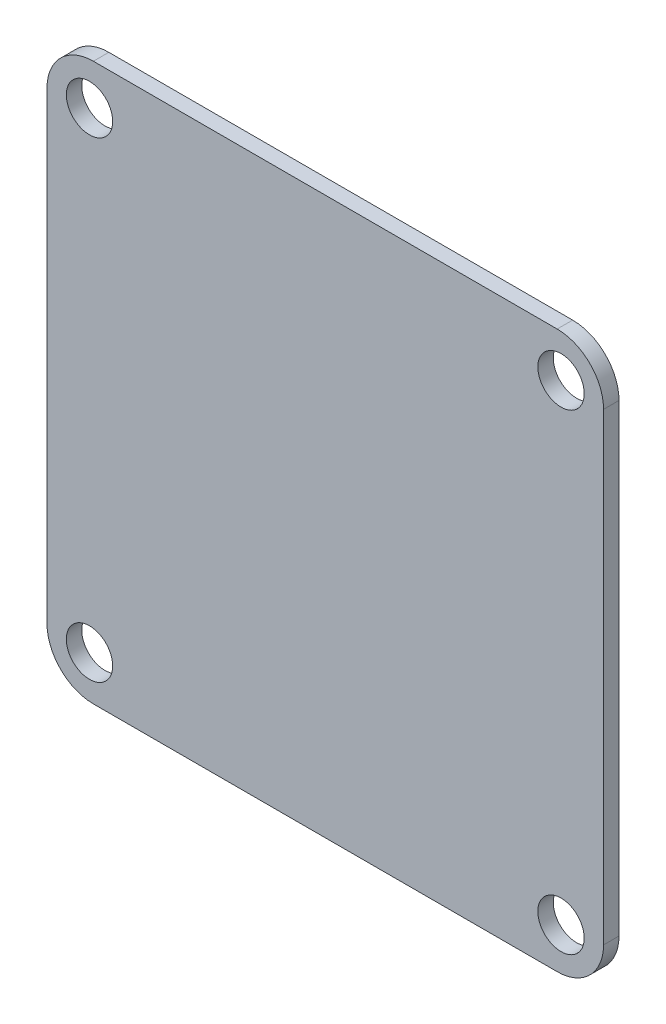
ISO-10303-21;
HEADER;
FILE_DESCRIPTION(('STEP AP214'),'2;1');
FILE_NAME('part.step','',(''),(''),'','','');
FILE_SCHEMA(('AUTOMOTIVE_DESIGN { 1 0 10303 214 1 1 1 1 }'));
ENDSEC;
DATA;
#1=APPLICATION_CONTEXT('core data for automotive mechanical design processes');
#2=APPLICATION_PROTOCOL_DEFINITION('international standard','automotive_design',2000,#1);
#3=PRODUCT_CONTEXT('',#1,'mechanical');
#4=PRODUCT('Part','Part','',(#3));
#5=PRODUCT_RELATED_PRODUCT_CATEGORY('part','',(#4));
#6=PRODUCT_DEFINITION_FORMATION('','',#4);
#7=PRODUCT_DEFINITION_CONTEXT('part definition',#1,'design');
#8=PRODUCT_DEFINITION('design','',#6,#7);
#9=PRODUCT_DEFINITION_SHAPE('','',#8);
#10=(LENGTH_UNIT() NAMED_UNIT(*) SI_UNIT(.MILLI.,.METRE.));
#11=(NAMED_UNIT(*) PLANE_ANGLE_UNIT() SI_UNIT($,.RADIAN.));
#12=(NAMED_UNIT(*) SI_UNIT($,.STERADIAN.) SOLID_ANGLE_UNIT());
#13=UNCERTAINTY_MEASURE_WITH_UNIT(LENGTH_MEASURE(1.E-05),#10,'distance_accuracy_value','');
#14=(GEOMETRIC_REPRESENTATION_CONTEXT(3) GLOBAL_UNCERTAINTY_ASSIGNED_CONTEXT((#13)) GLOBAL_UNIT_ASSIGNED_CONTEXT((#10,
#11,#12)) REPRESENTATION_CONTEXT('',''));
#15=CARTESIAN_POINT('',(0.,0.,0.));
#16=DIRECTION('',(0.,0.,1.));
#17=DIRECTION('',(1.,0.,0.));
#18=AXIS2_PLACEMENT_3D('',#15,#16,#17);
#19=CARTESIAN_POINT('',(-18.,-18.,1.));
#20=DIRECTION('',(1.,0.,0.));
#21=DIRECTION('',(0.,0.,-1.));
#22=AXIS2_PLACEMENT_3D('',#19,#20,#21);
#23=PLANE('',#22);
#24=DIRECTION('',(0.,-1.,0.));
#25=VECTOR('',#24,1.);
#26=CARTESIAN_POINT('',(-18.,-18.,0.));
#27=LINE('',#26,#25);
#28=CARTESIAN_POINT('',(-18.,15.,0.));
#29=VERTEX_POINT('',#28);
#30=CARTESIAN_POINT('',(-18.,-15.,0.));
#31=VERTEX_POINT('',#30);
#32=EDGE_CURVE('E130',#29,#31,#27,.T.);
#33=ORIENTED_EDGE('',*,*,#32,.T.);
#34=DIRECTION('',(0.,0.,-1.));
#35=VECTOR('',#34,1.);
#36=CARTESIAN_POINT('',(-18.,-15.,1.));
#37=LINE('',#36,#35);
#38=CARTESIAN_POINT('',(-18.,-15.,1.));
#39=VERTEX_POINT('',#38);
#40=EDGE_CURVE('E108',#31,#39,#37,.F.);
#41=ORIENTED_EDGE('',*,*,#40,.T.);
#42=DIRECTION('',(0.,-1.,0.));
#43=VECTOR('',#42,1.);
#44=CARTESIAN_POINT('',(-18.,-18.,1.));
#45=LINE('',#44,#43);
#46=CARTESIAN_POINT('',(-18.,15.,1.));
#47=VERTEX_POINT('',#46);
#48=EDGE_CURVE('E140',#47,#39,#45,.T.);
#49=ORIENTED_EDGE('',*,*,#48,.F.);
#50=DIRECTION('',(0.,0.,-1.));
#51=VECTOR('',#50,1.);
#52=CARTESIAN_POINT('',(-18.,15.,1.));
#53=LINE('',#52,#51);
#54=EDGE_CURVE('E113',#47,#29,#53,.T.);
#55=ORIENTED_EDGE('',*,*,#54,.T.);
#56=EDGE_LOOP('',(#33,#41,#49,#55));
#57=FACE_BOUND('',#56,.T.);
#58=ADVANCED_FACE('F37',(#57),#23,.F.);
#59=CARTESIAN_POINT('',(18.,-18.,1.));
#60=DIRECTION('',(0.,1.,0.));
#61=DIRECTION('',(-1.,0.,0.));
#62=AXIS2_PLACEMENT_3D('',#59,#60,#61);
#63=PLANE('',#62);
#64=DIRECTION('',(1.,0.,0.));
#65=VECTOR('',#64,1.);
#66=CARTESIAN_POINT('',(18.,-18.,1.));
#67=LINE('',#66,#65);
#68=CARTESIAN_POINT('',(-15.,-18.,1.));
#69=VERTEX_POINT('',#68);
#70=CARTESIAN_POINT('',(15.,-18.,1.));
#71=VERTEX_POINT('',#70);
#72=EDGE_CURVE('E123',#69,#71,#67,.T.);
#73=ORIENTED_EDGE('',*,*,#72,.F.);
#74=DIRECTION('',(0.,0.,-1.));
#75=VECTOR('',#74,1.);
#76=CARTESIAN_POINT('',(-15.,-18.,1.));
#77=LINE('',#76,#75);
#78=CARTESIAN_POINT('',(-15.,-18.,0.));
#79=VERTEX_POINT('',#78);
#80=EDGE_CURVE('E107',#69,#79,#77,.T.);
#81=ORIENTED_EDGE('',*,*,#80,.T.);
#82=DIRECTION('',(1.,0.,0.));
#83=VECTOR('',#82,1.);
#84=CARTESIAN_POINT('',(18.,-18.,0.));
#85=LINE('',#84,#83);
#86=CARTESIAN_POINT('',(15.,-18.,0.));
#87=VERTEX_POINT('',#86);
#88=EDGE_CURVE('E120',#79,#87,#85,.T.);
#89=ORIENTED_EDGE('',*,*,#88,.T.);
#90=DIRECTION('',(0.,0.,-1.));
#91=VECTOR('',#90,1.);
#92=CARTESIAN_POINT('',(15.,-18.,1.));
#93=LINE('',#92,#91);
#94=EDGE_CURVE('E125',#87,#71,#93,.F.);
#95=ORIENTED_EDGE('',*,*,#94,.T.);
#96=EDGE_LOOP('',(#73,#81,#89,#95));
#97=FACE_BOUND('',#96,.T.);
#98=ADVANCED_FACE('F119',(#97),#63,.F.);
#99=CARTESIAN_POINT('',(18.,-18.,1.));
#100=DIRECTION('',(-1.,0.,0.));
#101=DIRECTION('',(0.,0.,1.));
#102=AXIS2_PLACEMENT_3D('',#99,#100,#101);
#103=PLANE('',#102);
#104=DIRECTION('',(0.,1.,0.));
#105=VECTOR('',#104,1.);
#106=CARTESIAN_POINT('',(18.,-18.,1.));
#107=LINE('',#106,#105);
#108=CARTESIAN_POINT('',(18.,-15.,1.));
#109=VERTEX_POINT('',#108);
#110=CARTESIAN_POINT('',(18.,15.,1.));
#111=VERTEX_POINT('',#110);
#112=EDGE_CURVE('E166',#109,#111,#107,.T.);
#113=ORIENTED_EDGE('',*,*,#112,.F.);
#114=DIRECTION('',(0.,0.,-1.));
#115=VECTOR('',#114,1.);
#116=CARTESIAN_POINT('',(18.,-15.,1.));
#117=LINE('',#116,#115);
#118=CARTESIAN_POINT('',(18.,-15.,0.));
#119=VERTEX_POINT('',#118);
#120=EDGE_CURVE('E159',#109,#119,#117,.T.);
#121=ORIENTED_EDGE('',*,*,#120,.T.);
#122=DIRECTION('',(0.,1.,0.));
#123=VECTOR('',#122,1.);
#124=CARTESIAN_POINT('',(18.,-18.,0.));
#125=LINE('',#124,#123);
#126=CARTESIAN_POINT('',(18.,15.,0.));
#127=VERTEX_POINT('',#126);
#128=EDGE_CURVE('E129',#119,#127,#125,.T.);
#129=ORIENTED_EDGE('',*,*,#128,.T.);
#130=DIRECTION('',(0.,0.,-1.));
#131=VECTOR('',#130,1.);
#132=CARTESIAN_POINT('',(18.,15.,1.));
#133=LINE('',#132,#131);
#134=EDGE_CURVE('E157',#127,#111,#133,.F.);
#135=ORIENTED_EDGE('',*,*,#134,.T.);
#136=EDGE_LOOP('',(#113,#121,#129,#135));
#137=FACE_BOUND('',#136,.T.);
#138=ADVANCED_FACE('F164',(#137),#103,.F.);
#139=CARTESIAN_POINT('',(18.,18.,1.));
#140=DIRECTION('',(0.,-1.,0.));
#141=DIRECTION('',(1.,0.,0.));
#142=AXIS2_PLACEMENT_3D('',#139,#140,#141);
#143=PLANE('',#142);
#144=DIRECTION('',(-1.,0.,0.));
#145=VECTOR('',#144,1.);
#146=CARTESIAN_POINT('',(18.,18.,1.));
#147=LINE('',#146,#145);
#148=CARTESIAN_POINT('',(15.,18.,1.));
#149=VERTEX_POINT('',#148);
#150=CARTESIAN_POINT('',(-15.,18.,1.));
#151=VERTEX_POINT('',#150);
#152=EDGE_CURVE('E141',#149,#151,#147,.T.);
#153=ORIENTED_EDGE('',*,*,#152,.F.);
#154=DIRECTION('',(0.,0.,-1.));
#155=VECTOR('',#154,1.);
#156=CARTESIAN_POINT('',(15.,18.,1.));
#157=LINE('',#156,#155);
#158=CARTESIAN_POINT('',(15.,18.,0.));
#159=VERTEX_POINT('',#158);
#160=EDGE_CURVE('E11',#149,#159,#157,.T.);
#161=ORIENTED_EDGE('',*,*,#160,.T.);
#162=DIRECTION('',(-1.,0.,0.));
#163=VECTOR('',#162,1.);
#164=CARTESIAN_POINT('',(18.,18.,0.));
#165=LINE('',#164,#163);
#166=CARTESIAN_POINT('',(-15.,18.,0.));
#167=VERTEX_POINT('',#166);
#168=EDGE_CURVE('E133',#159,#167,#165,.T.);
#169=ORIENTED_EDGE('',*,*,#168,.T.);
#170=DIRECTION('',(0.,0.,-1.));
#171=VECTOR('',#170,1.);
#172=CARTESIAN_POINT('',(-15.,18.,1.));
#173=LINE('',#172,#171);
#174=EDGE_CURVE('E45',#167,#151,#173,.F.);
#175=ORIENTED_EDGE('',*,*,#174,.T.);
#176=EDGE_LOOP('',(#153,#161,#169,#175));
#177=FACE_BOUND('',#176,.T.);
#178=ADVANCED_FACE('F173',(#177),#143,.F.);
#179=CARTESIAN_POINT('',(0.,0.,1.));
#180=DIRECTION('',(0.,0.,1.));
#181=DIRECTION('',(1.,0.,0.));
#182=AXIS2_PLACEMENT_3D('',#179,#180,#181);
#183=PLANE('',#182);
#184=CARTESIAN_POINT('',(-15.25,-15.25,1.));
#185=DIRECTION('',(0.,0.,1.));
#186=DIRECTION('',(1.,0.,0.));
#187=AXIS2_PLACEMENT_3D('',#184,#185,#186);
#188=CIRCLE('',#187,1.5);
#189=CARTESIAN_POINT('',(-13.75,-15.25,1.));
#190=VERTEX_POINT('',#189);
#191=EDGE_CURVE('E189',#190,#190,#188,.T.);
#192=ORIENTED_EDGE('',*,*,#191,.F.);
#193=EDGE_LOOP('',(#192));
#194=FACE_BOUND('',#193,.T.);
#195=CARTESIAN_POINT('',(15.25,-15.25,1.));
#196=DIRECTION('',(0.,0.,1.));
#197=DIRECTION('',(1.,0.,0.));
#198=AXIS2_PLACEMENT_3D('',#195,#196,#197);
#199=CIRCLE('',#198,1.5);
#200=CARTESIAN_POINT('',(16.75,-15.25,1.));
#201=VERTEX_POINT('',#200);
#202=EDGE_CURVE('E195',#201,#201,#199,.T.);
#203=ORIENTED_EDGE('',*,*,#202,.F.);
#204=EDGE_LOOP('',(#203));
#205=FACE_BOUND('',#204,.T.);
#206=CARTESIAN_POINT('',(15.25,15.25,1.));
#207=DIRECTION('',(0.,0.,1.));
#208=DIRECTION('',(1.,0.,0.));
#209=AXIS2_PLACEMENT_3D('',#206,#207,#208);
#210=CIRCLE('',#209,1.5);
#211=CARTESIAN_POINT('',(16.75,15.25,1.));
#212=VERTEX_POINT('',#211);
#213=EDGE_CURVE('E183',#212,#212,#210,.T.);
#214=ORIENTED_EDGE('',*,*,#213,.F.);
#215=EDGE_LOOP('',(#214));
#216=FACE_BOUND('',#215,.T.);
#217=CARTESIAN_POINT('',(-15.25,15.25,1.));
#218=DIRECTION('',(0.,0.,1.));
#219=DIRECTION('',(1.,0.,0.));
#220=AXIS2_PLACEMENT_3D('',#217,#218,#219);
#221=CIRCLE('',#220,1.5);
#222=CARTESIAN_POINT('',(-13.75,15.25,1.));
#223=VERTEX_POINT('',#222);
#224=EDGE_CURVE('E180',#223,#223,#221,.T.);
#225=ORIENTED_EDGE('',*,*,#224,.F.);
#226=EDGE_LOOP('',(#225));
#227=FACE_BOUND('',#226,.T.);
#228=ORIENTED_EDGE('',*,*,#48,.T.);
#229=CARTESIAN_POINT('',(-15.,-15.,1.));
#230=DIRECTION('',(0.,0.,1.));
#231=DIRECTION('',(1.,0.,0.));
#232=AXIS2_PLACEMENT_3D('',#229,#230,#231);
#233=CIRCLE('',#232,3.);
#234=EDGE_CURVE('E155',#39,#69,#233,.T.);
#235=ORIENTED_EDGE('',*,*,#234,.T.);
#236=ORIENTED_EDGE('',*,*,#72,.T.);
#237=CARTESIAN_POINT('',(15.,-15.,1.));
#238=DIRECTION('',(0.,0.,1.));
#239=DIRECTION('',(1.,0.,0.));
#240=AXIS2_PLACEMENT_3D('',#237,#238,#239);
#241=CIRCLE('',#240,3.);
#242=EDGE_CURVE('E153',#71,#109,#241,.T.);
#243=ORIENTED_EDGE('',*,*,#242,.T.);
#244=ORIENTED_EDGE('',*,*,#112,.T.);
#245=CARTESIAN_POINT('',(15.,15.,1.));
#246=DIRECTION('',(0.,0.,1.));
#247=DIRECTION('',(1.,0.,0.));
#248=AXIS2_PLACEMENT_3D('',#245,#246,#247);
#249=CIRCLE('',#248,3.);
#250=EDGE_CURVE('E58',#111,#149,#249,.T.);
#251=ORIENTED_EDGE('',*,*,#250,.T.);
#252=ORIENTED_EDGE('',*,*,#152,.T.);
#253=CARTESIAN_POINT('',(-15.,15.,1.));
#254=DIRECTION('',(0.,0.,1.));
#255=DIRECTION('',(1.,0.,0.));
#256=AXIS2_PLACEMENT_3D('',#253,#254,#255);
#257=CIRCLE('',#256,3.);
#258=EDGE_CURVE('E150',#151,#47,#257,.T.);
#259=ORIENTED_EDGE('',*,*,#258,.T.);
#260=EDGE_LOOP('',(#228,#235,#236,#243,#244,#251,#252,#259));
#261=FACE_BOUND('',#260,.T.);
#262=ADVANCED_FACE('F206',(#194,#205,#216,#227,#261),#183,.T.);
#263=CARTESIAN_POINT('',(0.,0.,0.));
#264=DIRECTION('',(0.,0.,1.));
#265=DIRECTION('',(1.,0.,0.));
#266=AXIS2_PLACEMENT_3D('',#263,#264,#265);
#267=PLANE('',#266);
#268=CARTESIAN_POINT('',(-15.25,-15.25,0.));
#269=DIRECTION('',(0.,0.,1.));
#270=DIRECTION('',(1.,0.,0.));
#271=AXIS2_PLACEMENT_3D('',#268,#269,#270);
#272=CIRCLE('',#271,1.5);
#273=CARTESIAN_POINT('',(-13.75,-15.25,0.));
#274=VERTEX_POINT('',#273);
#275=EDGE_CURVE('E186',#274,#274,#272,.T.);
#276=ORIENTED_EDGE('',*,*,#275,.T.);
#277=EDGE_LOOP('',(#276));
#278=FACE_BOUND('',#277,.T.);
#279=CARTESIAN_POINT('',(15.25,-15.25,0.));
#280=DIRECTION('',(0.,0.,1.));
#281=DIRECTION('',(1.,0.,0.));
#282=AXIS2_PLACEMENT_3D('',#279,#280,#281);
#283=CIRCLE('',#282,1.5);
#284=CARTESIAN_POINT('',(16.75,-15.25,0.));
#285=VERTEX_POINT('',#284);
#286=EDGE_CURVE('E192',#285,#285,#283,.T.);
#287=ORIENTED_EDGE('',*,*,#286,.T.);
#288=EDGE_LOOP('',(#287));
#289=FACE_BOUND('',#288,.T.);
#290=CARTESIAN_POINT('',(15.25,15.25,0.));
#291=DIRECTION('',(0.,0.,1.));
#292=DIRECTION('',(1.,0.,0.));
#293=AXIS2_PLACEMENT_3D('',#290,#291,#292);
#294=CIRCLE('',#293,1.5);
#295=CARTESIAN_POINT('',(16.75,15.25,0.));
#296=VERTEX_POINT('',#295);
#297=EDGE_CURVE('E198',#296,#296,#294,.T.);
#298=ORIENTED_EDGE('',*,*,#297,.T.);
#299=EDGE_LOOP('',(#298));
#300=FACE_BOUND('',#299,.T.);
#301=CARTESIAN_POINT('',(-15.25,15.25,0.));
#302=DIRECTION('',(0.,0.,1.));
#303=DIRECTION('',(1.,0.,0.));
#304=AXIS2_PLACEMENT_3D('',#301,#302,#303);
#305=CIRCLE('',#304,1.5);
#306=CARTESIAN_POINT('',(-13.75,15.25,0.));
#307=VERTEX_POINT('',#306);
#308=EDGE_CURVE('E135',#307,#307,#305,.T.);
#309=ORIENTED_EDGE('',*,*,#308,.T.);
#310=EDGE_LOOP('',(#309));
#311=FACE_BOUND('',#310,.T.);
#312=ORIENTED_EDGE('',*,*,#88,.F.);
#313=CARTESIAN_POINT('',(-15.,-15.,0.));
#314=DIRECTION('',(0.,0.,1.));
#315=DIRECTION('',(1.,0.,0.));
#316=AXIS2_PLACEMENT_3D('',#313,#314,#315);
#317=CIRCLE('',#316,3.);
#318=EDGE_CURVE('E103',#79,#31,#317,.F.);
#319=ORIENTED_EDGE('',*,*,#318,.T.);
#320=ORIENTED_EDGE('',*,*,#32,.F.);
#321=CARTESIAN_POINT('',(-15.,15.,0.));
#322=DIRECTION('',(0.,0.,1.));
#323=DIRECTION('',(1.,0.,0.));
#324=AXIS2_PLACEMENT_3D('',#321,#322,#323);
#325=CIRCLE('',#324,3.);
#326=EDGE_CURVE('E124',#29,#167,#325,.F.);
#327=ORIENTED_EDGE('',*,*,#326,.T.);
#328=ORIENTED_EDGE('',*,*,#168,.F.);
#329=CARTESIAN_POINT('',(15.,15.,0.));
#330=DIRECTION('',(0.,0.,1.));
#331=DIRECTION('',(1.,0.,0.));
#332=AXIS2_PLACEMENT_3D('',#329,#330,#331);
#333=CIRCLE('',#332,3.);
#334=EDGE_CURVE('E144',#159,#127,#333,.F.);
#335=ORIENTED_EDGE('',*,*,#334,.T.);
#336=ORIENTED_EDGE('',*,*,#128,.F.);
#337=CARTESIAN_POINT('',(15.,-15.,0.));
#338=DIRECTION('',(0.,0.,1.));
#339=DIRECTION('',(1.,0.,0.));
#340=AXIS2_PLACEMENT_3D('',#337,#338,#339);
#341=CIRCLE('',#340,3.);
#342=EDGE_CURVE('E114',#119,#87,#341,.F.);
#343=ORIENTED_EDGE('',*,*,#342,.T.);
#344=EDGE_LOOP('',(#312,#319,#320,#327,#328,#335,#336,#343));
#345=FACE_BOUND('',#344,.T.);
#346=ADVANCED_FACE('F127',(#278,#289,#300,#311,#345),#267,.F.);
#347=CARTESIAN_POINT('',(-15.,-15.,1.));
#348=DIRECTION('',(0.,0.,-1.));
#349=DIRECTION('',(-1.,0.,0.));
#350=AXIS2_PLACEMENT_3D('',#347,#348,#349);
#351=CYLINDRICAL_SURFACE('',#350,3.);
#352=ORIENTED_EDGE('',*,*,#234,.F.);
#353=ORIENTED_EDGE('',*,*,#40,.F.);
#354=ORIENTED_EDGE('',*,*,#318,.F.);
#355=ORIENTED_EDGE('',*,*,#80,.F.);
#356=EDGE_LOOP('',(#352,#353,#354,#355));
#357=FACE_BOUND('',#356,.T.);
#358=ADVANCED_FACE('F106',(#357),#351,.T.);
#359=CARTESIAN_POINT('',(15.,-15.,1.));
#360=DIRECTION('',(0.,0.,-1.));
#361=DIRECTION('',(-1.,0.,0.));
#362=AXIS2_PLACEMENT_3D('',#359,#360,#361);
#363=CYLINDRICAL_SURFACE('',#362,3.);
#364=ORIENTED_EDGE('',*,*,#242,.F.);
#365=ORIENTED_EDGE('',*,*,#94,.F.);
#366=ORIENTED_EDGE('',*,*,#342,.F.);
#367=ORIENTED_EDGE('',*,*,#120,.F.);
#368=EDGE_LOOP('',(#364,#365,#366,#367));
#369=FACE_BOUND('',#368,.T.);
#370=ADVANCED_FACE('F224',(#369),#363,.T.);
#371=CARTESIAN_POINT('',(15.,15.,1.));
#372=DIRECTION('',(0.,0.,-1.));
#373=DIRECTION('',(-1.,0.,0.));
#374=AXIS2_PLACEMENT_3D('',#371,#372,#373);
#375=CYLINDRICAL_SURFACE('',#374,3.);
#376=ORIENTED_EDGE('',*,*,#250,.F.);
#377=ORIENTED_EDGE('',*,*,#134,.F.);
#378=ORIENTED_EDGE('',*,*,#334,.F.);
#379=ORIENTED_EDGE('',*,*,#160,.F.);
#380=EDGE_LOOP('',(#376,#377,#378,#379));
#381=FACE_BOUND('',#380,.T.);
#382=ADVANCED_FACE('F172',(#381),#375,.T.);
#383=CARTESIAN_POINT('',(-15.,15.,1.));
#384=DIRECTION('',(0.,0.,-1.));
#385=DIRECTION('',(-1.,0.,0.));
#386=AXIS2_PLACEMENT_3D('',#383,#384,#385);
#387=CYLINDRICAL_SURFACE('',#386,3.);
#388=ORIENTED_EDGE('',*,*,#258,.F.);
#389=ORIENTED_EDGE('',*,*,#174,.F.);
#390=ORIENTED_EDGE('',*,*,#326,.F.);
#391=ORIENTED_EDGE('',*,*,#54,.F.);
#392=EDGE_LOOP('',(#388,#389,#390,#391));
#393=FACE_BOUND('',#392,.T.);
#394=ADVANCED_FACE('F39',(#393),#387,.T.);
#395=CARTESIAN_POINT('',(-15.25,15.25,0.));
#396=DIRECTION('',(0.,0.,1.));
#397=DIRECTION('',(1.,0.,0.));
#398=AXIS2_PLACEMENT_3D('',#395,#396,#397);
#399=CYLINDRICAL_SURFACE('',#398,1.5);
#400=ORIENTED_EDGE('',*,*,#308,.F.);
#401=EDGE_LOOP('',(#400));
#402=FACE_BOUND('',#401,.T.);
#403=ORIENTED_EDGE('',*,*,#224,.T.);
#404=EDGE_LOOP('',(#403));
#405=FACE_BOUND('',#404,.T.);
#406=ADVANCED_FACE('F217',(#402,#405),#399,.F.);
#407=CARTESIAN_POINT('',(15.25,15.25,0.));
#408=DIRECTION('',(0.,0.,1.));
#409=DIRECTION('',(1.,0.,0.));
#410=AXIS2_PLACEMENT_3D('',#407,#408,#409);
#411=CYLINDRICAL_SURFACE('',#410,1.5);
#412=ORIENTED_EDGE('',*,*,#297,.F.);
#413=EDGE_LOOP('',(#412));
#414=FACE_BOUND('',#413,.T.);
#415=ORIENTED_EDGE('',*,*,#213,.T.);
#416=EDGE_LOOP('',(#415));
#417=FACE_BOUND('',#416,.T.);
#418=ADVANCED_FACE('F204',(#414,#417),#411,.F.);
#419=CARTESIAN_POINT('',(15.25,-15.25,0.));
#420=DIRECTION('',(0.,0.,1.));
#421=DIRECTION('',(1.,0.,0.));
#422=AXIS2_PLACEMENT_3D('',#419,#420,#421);
#423=CYLINDRICAL_SURFACE('',#422,1.5);
#424=ORIENTED_EDGE('',*,*,#286,.F.);
#425=EDGE_LOOP('',(#424));
#426=FACE_BOUND('',#425,.T.);
#427=ORIENTED_EDGE('',*,*,#202,.T.);
#428=EDGE_LOOP('',(#427));
#429=FACE_BOUND('',#428,.T.);
#430=ADVANCED_FACE('F286',(#426,#429),#423,.F.);
#431=CARTESIAN_POINT('',(-15.25,-15.25,0.));
#432=DIRECTION('',(0.,0.,1.));
#433=DIRECTION('',(1.,0.,0.));
#434=AXIS2_PLACEMENT_3D('',#431,#432,#433);
#435=CYLINDRICAL_SURFACE('',#434,1.5);
#436=ORIENTED_EDGE('',*,*,#275,.F.);
#437=EDGE_LOOP('',(#436));
#438=FACE_BOUND('',#437,.T.);
#439=ORIENTED_EDGE('',*,*,#191,.T.);
#440=EDGE_LOOP('',(#439));
#441=FACE_BOUND('',#440,.T.);
#442=ADVANCED_FACE('F297',(#438,#441),#435,.F.);
#443=CLOSED_SHELL('',(#58,#98,#138,#178,#262,#346,#358,#370,#382,#394,#406,#418,#430,#442));
#444=MANIFOLD_SOLID_BREP('B2',#443);
#445=ADVANCED_BREP_SHAPE_REPRESENTATION('',(#18,#444),#14);
#446=SHAPE_DEFINITION_REPRESENTATION(#9,#445);
ENDSEC;
END-ISO-10303-21;
